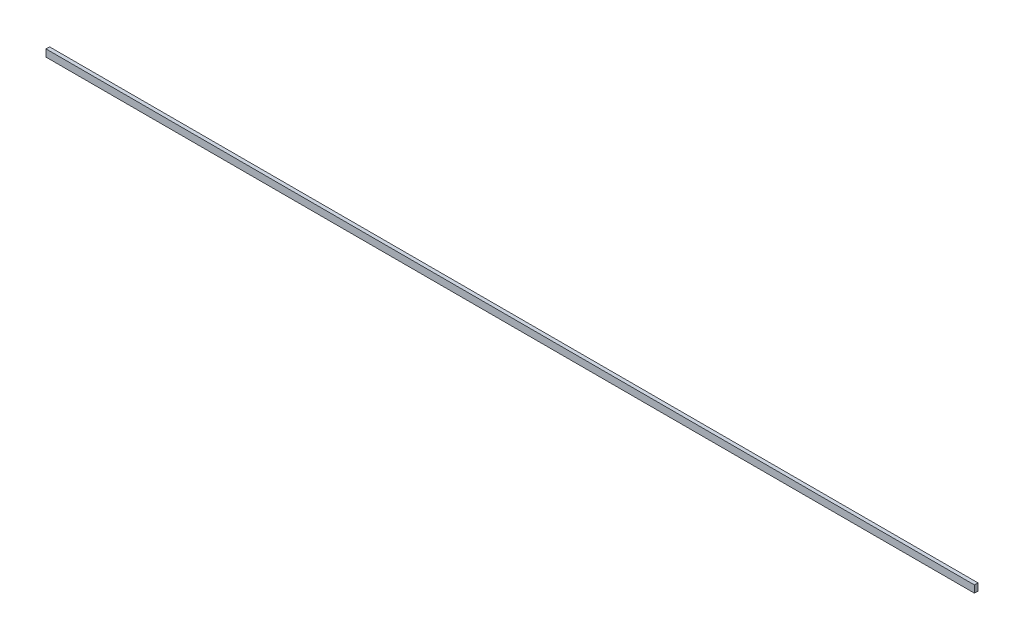
ISO-10303-21;
HEADER;
FILE_DESCRIPTION(('STEP AP214'),'2;1');
FILE_NAME('part.step','',(''),(''),'','','');
FILE_SCHEMA(('AUTOMOTIVE_DESIGN { 1 0 10303 214 1 1 1 1 }'));
ENDSEC;
DATA;
#1=APPLICATION_CONTEXT('core data for automotive mechanical design processes');
#2=APPLICATION_PROTOCOL_DEFINITION('international standard','automotive_design',2000,#1);
#3=PRODUCT_CONTEXT('',#1,'mechanical');
#4=PRODUCT('Part','Part','',(#3));
#5=PRODUCT_RELATED_PRODUCT_CATEGORY('part','',(#4));
#6=PRODUCT_DEFINITION_FORMATION('','',#4);
#7=PRODUCT_DEFINITION_CONTEXT('part definition',#1,'design');
#8=PRODUCT_DEFINITION('design','',#6,#7);
#9=PRODUCT_DEFINITION_SHAPE('','',#8);
#10=(LENGTH_UNIT() NAMED_UNIT(*) SI_UNIT(.MILLI.,.METRE.));
#11=(NAMED_UNIT(*) PLANE_ANGLE_UNIT() SI_UNIT($,.RADIAN.));
#12=(NAMED_UNIT(*) SI_UNIT($,.STERADIAN.) SOLID_ANGLE_UNIT());
#13=UNCERTAINTY_MEASURE_WITH_UNIT(LENGTH_MEASURE(1.E-05),#10,'distance_accuracy_value','');
#14=(GEOMETRIC_REPRESENTATION_CONTEXT(3) GLOBAL_UNCERTAINTY_ASSIGNED_CONTEXT((#13)) GLOBAL_UNIT_ASSIGNED_CONTEXT((#10,
#11,#12)) REPRESENTATION_CONTEXT('',''));
#15=CARTESIAN_POINT('',(0.,0.,0.));
#16=DIRECTION('',(0.,0.,1.));
#17=DIRECTION('',(1.,0.,0.));
#18=AXIS2_PLACEMENT_3D('',#15,#16,#17);
#19=CARTESIAN_POINT('',(0.,10.,0.));
#20=DIRECTION('',(1.,0.,0.));
#21=DIRECTION('',(0.,0.,-1.));
#22=AXIS2_PLACEMENT_3D('',#19,#20,#21);
#23=PLANE('',#22);
#24=DIRECTION('',(0.,0.,1.));
#25=VECTOR('',#24,1.);
#26=CARTESIAN_POINT('',(0.,0.,0.));
#27=LINE('',#26,#25);
#28=CARTESIAN_POINT('',(0.,0.,0.));
#29=VERTEX_POINT('',#28);
#30=CARTESIAN_POINT('',(0.,0.,5.));
#31=VERTEX_POINT('',#30);
#32=EDGE_CURVE('E107',#29,#31,#27,.T.);
#33=ORIENTED_EDGE('',*,*,#32,.T.);
#34=DIRECTION('',(0.,-1.,0.));
#35=VECTOR('',#34,1.);
#36=CARTESIAN_POINT('',(0.,10.,5.));
#37=LINE('',#36,#35);
#38=CARTESIAN_POINT('',(0.,10.,5.));
#39=VERTEX_POINT('',#38);
#40=EDGE_CURVE('E11',#39,#31,#37,.T.);
#41=ORIENTED_EDGE('',*,*,#40,.F.);
#42=DIRECTION('',(0.,0.,1.));
#43=VECTOR('',#42,1.);
#44=CARTESIAN_POINT('',(0.,10.,0.));
#45=LINE('',#44,#43);
#46=CARTESIAN_POINT('',(0.,10.,0.));
#47=VERTEX_POINT('',#46);
#48=EDGE_CURVE('E89',#47,#39,#45,.T.);
#49=ORIENTED_EDGE('',*,*,#48,.F.);
#50=DIRECTION('',(0.,-1.,0.));
#51=VECTOR('',#50,1.);
#52=CARTESIAN_POINT('',(0.,10.,0.));
#53=LINE('',#52,#51);
#54=EDGE_CURVE('E56',#47,#29,#53,.T.);
#55=ORIENTED_EDGE('',*,*,#54,.T.);
#56=EDGE_LOOP('',(#33,#41,#49,#55));
#57=FACE_BOUND('',#56,.T.);
#58=ADVANCED_FACE('F39',(#57),#23,.F.);
#59=CARTESIAN_POINT('',(0.,10.,5.));
#60=DIRECTION('',(0.,0.,-1.));
#61=DIRECTION('',(-1.,0.,0.));
#62=AXIS2_PLACEMENT_3D('',#59,#60,#61);
#63=PLANE('',#62);
#64=DIRECTION('',(1.,0.,0.));
#65=VECTOR('',#64,1.);
#66=CARTESIAN_POINT('',(0.,0.,5.));
#67=LINE('',#66,#65);
#68=CARTESIAN_POINT('',(1300.,0.,5.));
#69=VERTEX_POINT('',#68);
#70=EDGE_CURVE('E95',#31,#69,#67,.T.);
#71=ORIENTED_EDGE('',*,*,#70,.T.);
#72=DIRECTION('',(0.,-1.,0.));
#73=VECTOR('',#72,1.);
#74=CARTESIAN_POINT('',(1300.,10.,5.));
#75=LINE('',#74,#73);
#76=CARTESIAN_POINT('',(1300.,10.,5.));
#77=VERTEX_POINT('',#76);
#78=EDGE_CURVE('E48',#77,#69,#75,.T.);
#79=ORIENTED_EDGE('',*,*,#78,.F.);
#80=DIRECTION('',(1.,0.,0.));
#81=VECTOR('',#80,1.);
#82=CARTESIAN_POINT('',(0.,10.,5.));
#83=LINE('',#82,#81);
#84=EDGE_CURVE('E81',#39,#77,#83,.T.);
#85=ORIENTED_EDGE('',*,*,#84,.F.);
#86=ORIENTED_EDGE('',*,*,#40,.T.);
#87=EDGE_LOOP('',(#71,#79,#85,#86));
#88=FACE_BOUND('',#87,.T.);
#89=ADVANCED_FACE('F94',(#88),#63,.F.);
#90=CARTESIAN_POINT('',(1300.,10.,0.));
#91=DIRECTION('',(1.,0.,0.));
#92=DIRECTION('',(0.,0.,-1.));
#93=AXIS2_PLACEMENT_3D('',#90,#91,#92);
#94=PLANE('',#93);
#95=DIRECTION('',(0.,0.,1.));
#96=VECTOR('',#95,1.);
#97=CARTESIAN_POINT('',(1300.,0.,0.));
#98=LINE('',#97,#96);
#99=CARTESIAN_POINT('',(1300.,0.,0.));
#100=VERTEX_POINT('',#99);
#101=EDGE_CURVE('E112',#100,#69,#98,.T.);
#102=ORIENTED_EDGE('',*,*,#101,.F.);
#103=DIRECTION('',(0.,-1.,0.));
#104=VECTOR('',#103,1.);
#105=CARTESIAN_POINT('',(1300.,10.,0.));
#106=LINE('',#105,#104);
#107=CARTESIAN_POINT('',(1300.,10.,0.));
#108=VERTEX_POINT('',#107);
#109=EDGE_CURVE('E70',#108,#100,#106,.T.);
#110=ORIENTED_EDGE('',*,*,#109,.F.);
#111=DIRECTION('',(0.,0.,1.));
#112=VECTOR('',#111,1.);
#113=CARTESIAN_POINT('',(1300.,10.,0.));
#114=LINE('',#113,#112);
#115=EDGE_CURVE('E88',#108,#77,#114,.T.);
#116=ORIENTED_EDGE('',*,*,#115,.T.);
#117=ORIENTED_EDGE('',*,*,#78,.T.);
#118=EDGE_LOOP('',(#102,#110,#116,#117));
#119=FACE_BOUND('',#118,.T.);
#120=ADVANCED_FACE('F99',(#119),#94,.T.);
#121=CARTESIAN_POINT('',(0.,10.,0.));
#122=DIRECTION('',(0.,0.,-1.));
#123=DIRECTION('',(-1.,0.,0.));
#124=AXIS2_PLACEMENT_3D('',#121,#122,#123);
#125=PLANE('',#124);
#126=DIRECTION('',(1.,0.,0.));
#127=VECTOR('',#126,1.);
#128=CARTESIAN_POINT('',(0.,0.,0.));
#129=LINE('',#128,#127);
#130=EDGE_CURVE('E115',#29,#100,#129,.T.);
#131=ORIENTED_EDGE('',*,*,#130,.F.);
#132=ORIENTED_EDGE('',*,*,#54,.F.);
#133=DIRECTION('',(1.,0.,0.));
#134=VECTOR('',#133,1.);
#135=CARTESIAN_POINT('',(0.,10.,0.));
#136=LINE('',#135,#134);
#137=EDGE_CURVE('E101',#47,#108,#136,.T.);
#138=ORIENTED_EDGE('',*,*,#137,.T.);
#139=ORIENTED_EDGE('',*,*,#109,.T.);
#140=EDGE_LOOP('',(#131,#132,#138,#139));
#141=FACE_BOUND('',#140,.T.);
#142=ADVANCED_FACE('F125',(#141),#125,.T.);
#143=CARTESIAN_POINT('',(0.,10.,0.));
#144=DIRECTION('',(0.,1.,0.));
#145=DIRECTION('',(0.,0.,1.));
#146=AXIS2_PLACEMENT_3D('',#143,#144,#145);
#147=PLANE('',#146);
#148=ORIENTED_EDGE('',*,*,#48,.T.);
#149=ORIENTED_EDGE('',*,*,#84,.T.);
#150=ORIENTED_EDGE('',*,*,#115,.F.);
#151=ORIENTED_EDGE('',*,*,#137,.F.);
#152=EDGE_LOOP('',(#148,#149,#150,#151));
#153=FACE_BOUND('',#152,.T.);
#154=ADVANCED_FACE('F85',(#153),#147,.T.);
#155=CARTESIAN_POINT('',(0.,0.,0.));
#156=DIRECTION('',(0.,1.,0.));
#157=DIRECTION('',(0.,0.,1.));
#158=AXIS2_PLACEMENT_3D('',#155,#156,#157);
#159=PLANE('',#158);
#160=ORIENTED_EDGE('',*,*,#32,.F.);
#161=ORIENTED_EDGE('',*,*,#130,.T.);
#162=ORIENTED_EDGE('',*,*,#101,.T.);
#163=ORIENTED_EDGE('',*,*,#70,.F.);
#164=EDGE_LOOP('',(#160,#161,#162,#163));
#165=FACE_BOUND('',#164,.T.);
#166=ADVANCED_FACE('F124',(#165),#159,.F.);
#167=CLOSED_SHELL('',(#58,#89,#120,#142,#154,#166));
#168=MANIFOLD_SOLID_BREP('B2',#167);
#169=ADVANCED_BREP_SHAPE_REPRESENTATION('',(#18,#168),#14);
#170=SHAPE_DEFINITION_REPRESENTATION(#9,#169);
ENDSEC;
END-ISO-10303-21;
